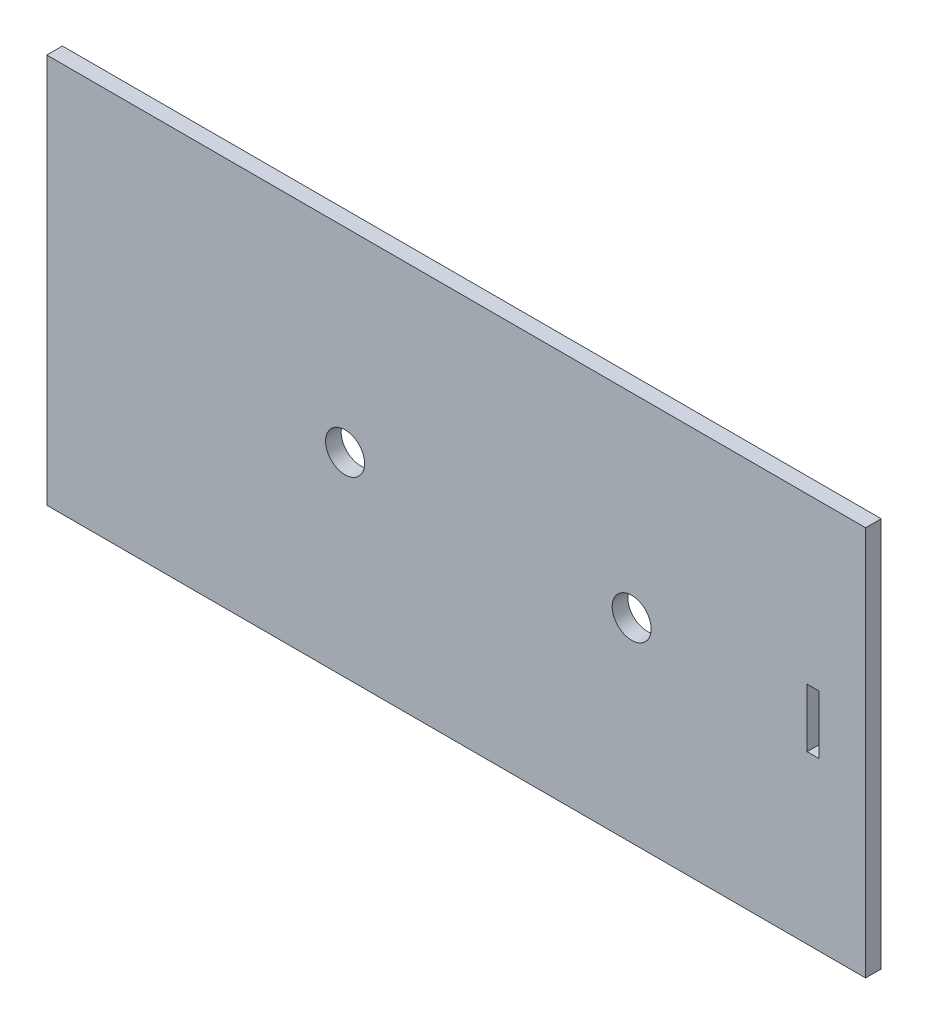
ISO-10303-21;
HEADER;
FILE_DESCRIPTION(('STEP AP214'),'2;1');
FILE_NAME('part.step','',(''),(''),'','','');
FILE_SCHEMA(('AUTOMOTIVE_DESIGN { 1 0 10303 214 1 1 1 1 }'));
ENDSEC;
DATA;
#1=APPLICATION_CONTEXT('core data for automotive mechanical design processes');
#2=APPLICATION_PROTOCOL_DEFINITION('international standard','automotive_design',2000,#1);
#3=PRODUCT_CONTEXT('',#1,'mechanical');
#4=PRODUCT('Part','Part','',(#3));
#5=PRODUCT_RELATED_PRODUCT_CATEGORY('part','',(#4));
#6=PRODUCT_DEFINITION_FORMATION('','',#4);
#7=PRODUCT_DEFINITION_CONTEXT('part definition',#1,'design');
#8=PRODUCT_DEFINITION('design','',#6,#7);
#9=PRODUCT_DEFINITION_SHAPE('','',#8);
#10=(LENGTH_UNIT() NAMED_UNIT(*) SI_UNIT(.MILLI.,.METRE.));
#11=(NAMED_UNIT(*) PLANE_ANGLE_UNIT() SI_UNIT($,.RADIAN.));
#12=(NAMED_UNIT(*) SI_UNIT($,.STERADIAN.) SOLID_ANGLE_UNIT());
#13=UNCERTAINTY_MEASURE_WITH_UNIT(LENGTH_MEASURE(1.E-05),#10,'distance_accuracy_value','');
#14=(GEOMETRIC_REPRESENTATION_CONTEXT(3) GLOBAL_UNCERTAINTY_ASSIGNED_CONTEXT((#13)) GLOBAL_UNIT_ASSIGNED_CONTEXT((#10,
#11,#12)) REPRESENTATION_CONTEXT('',''));
#15=CARTESIAN_POINT('',(0.,0.,0.));
#16=DIRECTION('',(0.,0.,1.));
#17=DIRECTION('',(1.,0.,0.));
#18=AXIS2_PLACEMENT_3D('',#15,#16,#17);
#19=CARTESIAN_POINT('',(0.,0.,4.));
#20=DIRECTION('',(0.,0.,-1.));
#21=DIRECTION('',(-1.,0.,0.));
#22=AXIS2_PLACEMENT_3D('',#19,#20,#21);
#23=PLANE('',#22);
#24=CARTESIAN_POINT('',(0.,0.,4.));
#25=DIRECTION('',(0.,0.,1.));
#26=DIRECTION('',(1.,0.,0.));
#27=AXIS2_PLACEMENT_3D('',#24,#25,#26);
#28=CIRCLE('',#27,5.);
#29=CARTESIAN_POINT('',(5.,0.,4.));
#30=VERTEX_POINT('',#29);
#31=EDGE_CURVE('E136',#30,#30,#28,.T.);
#32=ORIENTED_EDGE('',*,*,#31,.F.);
#33=EDGE_LOOP('',(#32));
#34=FACE_BOUND('',#33,.T.);
#35=DIRECTION('',(0.,1.,0.));
#36=VECTOR('',#35,1.);
#37=CARTESIAN_POINT('',(60.,-50.,4.));
#38=LINE('',#37,#36);
#39=CARTESIAN_POINT('',(60.,-50.,4.));
#40=VERTEX_POINT('',#39);
#41=CARTESIAN_POINT('',(60.,50.,4.));
#42=VERTEX_POINT('',#41);
#43=EDGE_CURVE('E142',#40,#42,#38,.T.);
#44=ORIENTED_EDGE('',*,*,#43,.T.);
#45=DIRECTION('',(-1.,0.,0.));
#46=VECTOR('',#45,1.);
#47=CARTESIAN_POINT('',(-150.,50.,4.));
#48=LINE('',#47,#46);
#49=CARTESIAN_POINT('',(-150.,50.,4.));
#50=VERTEX_POINT('',#49);
#51=EDGE_CURVE('E145',#42,#50,#48,.T.);
#52=ORIENTED_EDGE('',*,*,#51,.T.);
#53=DIRECTION('',(0.,-1.,0.));
#54=VECTOR('',#53,1.);
#55=CARTESIAN_POINT('',(-150.,-50.,4.));
#56=LINE('',#55,#54);
#57=CARTESIAN_POINT('',(-150.,-50.,4.));
#58=VERTEX_POINT('',#57);
#59=EDGE_CURVE('E148',#50,#58,#56,.T.);
#60=ORIENTED_EDGE('',*,*,#59,.T.);
#61=DIRECTION('',(1.,0.,0.));
#62=VECTOR('',#61,1.);
#63=CARTESIAN_POINT('',(-150.,-50.,4.));
#64=LINE('',#63,#62);
#65=EDGE_CURVE('E150',#58,#40,#64,.T.);
#66=ORIENTED_EDGE('',*,*,#65,.T.);
#67=EDGE_LOOP('',(#44,#52,#60,#66));
#68=FACE_BOUND('',#67,.T.);
#69=DIRECTION('',(0.,1.,0.));
#70=VECTOR('',#69,1.);
#71=CARTESIAN_POINT('',(48.,7.76206531965649,4.));
#72=LINE('',#71,#70);
#73=CARTESIAN_POINT('',(48.,-7.23793468034351,4.));
#74=VERTEX_POINT('',#73);
#75=CARTESIAN_POINT('',(48.,7.76206531965649,4.));
#76=VERTEX_POINT('',#75);
#77=EDGE_CURVE('E97',#74,#76,#72,.T.);
#78=ORIENTED_EDGE('',*,*,#77,.F.);
#79=DIRECTION('',(1.,0.,0.));
#80=VECTOR('',#79,1.);
#81=CARTESIAN_POINT('',(45.,-7.23793468034351,4.));
#82=LINE('',#81,#80);
#83=CARTESIAN_POINT('',(45.,-7.23793468034351,4.));
#84=VERTEX_POINT('',#83);
#85=EDGE_CURVE('E120',#84,#74,#82,.T.);
#86=ORIENTED_EDGE('',*,*,#85,.F.);
#87=DIRECTION('',(0.,-1.,0.));
#88=VECTOR('',#87,1.);
#89=CARTESIAN_POINT('',(45.,7.76206531965649,4.));
#90=LINE('',#89,#88);
#91=CARTESIAN_POINT('',(45.,7.76206531965649,4.));
#92=VERTEX_POINT('',#91);
#93=EDGE_CURVE('E118',#92,#84,#90,.T.);
#94=ORIENTED_EDGE('',*,*,#93,.F.);
#95=DIRECTION('',(-1.,0.,0.));
#96=VECTOR('',#95,1.);
#97=CARTESIAN_POINT('',(45.,7.76206531965649,4.));
#98=LINE('',#97,#96);
#99=EDGE_CURVE('E105',#76,#92,#98,.T.);
#100=ORIENTED_EDGE('',*,*,#99,.F.);
#101=EDGE_LOOP('',(#78,#86,#94,#100));
#102=FACE_BOUND('',#101,.T.);
#103=CARTESIAN_POINT('',(-73.5,0.,4.));
#104=DIRECTION('',(0.,0.,1.));
#105=DIRECTION('',(1.,0.,0.));
#106=AXIS2_PLACEMENT_3D('',#103,#104,#105);
#107=CIRCLE('',#106,5.);
#108=CARTESIAN_POINT('',(-68.5,0.,4.));
#109=VERTEX_POINT('',#108);
#110=EDGE_CURVE('E126',#109,#109,#107,.T.);
#111=ORIENTED_EDGE('',*,*,#110,.F.);
#112=EDGE_LOOP('',(#111));
#113=FACE_BOUND('',#112,.T.);
#114=ADVANCED_FACE('F32',(#34,#68,#102,#113),#23,.F.);
#115=CARTESIAN_POINT('',(0.,0.,0.));
#116=DIRECTION('',(0.,0.,-1.));
#117=DIRECTION('',(-1.,0.,0.));
#118=AXIS2_PLACEMENT_3D('',#115,#116,#117);
#119=PLANE('',#118);
#120=DIRECTION('',(1.,0.,0.));
#121=VECTOR('',#120,1.);
#122=CARTESIAN_POINT('',(45.,-7.23793468034351,0.));
#123=LINE('',#122,#121);
#124=CARTESIAN_POINT('',(45.,-7.23793468034351,0.));
#125=VERTEX_POINT('',#124);
#126=CARTESIAN_POINT('',(48.,-7.23793468034351,0.));
#127=VERTEX_POINT('',#126);
#128=EDGE_CURVE('E106',#125,#127,#123,.T.);
#129=ORIENTED_EDGE('',*,*,#128,.T.);
#130=DIRECTION('',(0.,1.,0.));
#131=VECTOR('',#130,1.);
#132=CARTESIAN_POINT('',(48.,7.76206531965649,0.));
#133=LINE('',#132,#131);
#134=CARTESIAN_POINT('',(48.,7.76206531965649,0.));
#135=VERTEX_POINT('',#134);
#136=EDGE_CURVE('E55',#127,#135,#133,.T.);
#137=ORIENTED_EDGE('',*,*,#136,.T.);
#138=DIRECTION('',(-1.,0.,0.));
#139=VECTOR('',#138,1.);
#140=CARTESIAN_POINT('',(45.,7.76206531965649,0.));
#141=LINE('',#140,#139);
#142=CARTESIAN_POINT('',(45.,7.76206531965649,0.));
#143=VERTEX_POINT('',#142);
#144=EDGE_CURVE('E112',#135,#143,#141,.T.);
#145=ORIENTED_EDGE('',*,*,#144,.T.);
#146=DIRECTION('',(0.,-1.,0.));
#147=VECTOR('',#146,1.);
#148=CARTESIAN_POINT('',(45.,7.76206531965649,0.));
#149=LINE('',#148,#147);
#150=EDGE_CURVE('E128',#143,#125,#149,.T.);
#151=ORIENTED_EDGE('',*,*,#150,.T.);
#152=EDGE_LOOP('',(#129,#137,#145,#151));
#153=FACE_BOUND('',#152,.T.);
#154=CARTESIAN_POINT('',(0.,0.,0.));
#155=DIRECTION('',(0.,0.,1.));
#156=DIRECTION('',(1.,0.,0.));
#157=AXIS2_PLACEMENT_3D('',#154,#155,#156);
#158=CIRCLE('',#157,5.);
#159=CARTESIAN_POINT('',(5.,0.,0.));
#160=VERTEX_POINT('',#159);
#161=EDGE_CURVE('E113',#160,#160,#158,.T.);
#162=ORIENTED_EDGE('',*,*,#161,.T.);
#163=EDGE_LOOP('',(#162));
#164=FACE_BOUND('',#163,.T.);
#165=DIRECTION('',(0.,1.,0.));
#166=VECTOR('',#165,1.);
#167=CARTESIAN_POINT('',(60.,-50.,0.));
#168=LINE('',#167,#166);
#169=CARTESIAN_POINT('',(60.,-50.,0.));
#170=VERTEX_POINT('',#169);
#171=CARTESIAN_POINT('',(60.,50.,0.));
#172=VERTEX_POINT('',#171);
#173=EDGE_CURVE('E139',#170,#172,#168,.T.);
#174=ORIENTED_EDGE('',*,*,#173,.F.);
#175=DIRECTION('',(1.,0.,0.));
#176=VECTOR('',#175,1.);
#177=CARTESIAN_POINT('',(-150.,-50.,0.));
#178=LINE('',#177,#176);
#179=CARTESIAN_POINT('',(-150.,-50.,0.));
#180=VERTEX_POINT('',#179);
#181=EDGE_CURVE('E146',#180,#170,#178,.T.);
#182=ORIENTED_EDGE('',*,*,#181,.F.);
#183=DIRECTION('',(0.,-1.,0.));
#184=VECTOR('',#183,1.);
#185=CARTESIAN_POINT('',(-150.,-50.,0.));
#186=LINE('',#185,#184);
#187=CARTESIAN_POINT('',(-150.,50.,0.));
#188=VERTEX_POINT('',#187);
#189=EDGE_CURVE('E157',#188,#180,#186,.T.);
#190=ORIENTED_EDGE('',*,*,#189,.F.);
#191=DIRECTION('',(-1.,0.,0.));
#192=VECTOR('',#191,1.);
#193=CARTESIAN_POINT('',(-150.,50.,0.));
#194=LINE('',#193,#192);
#195=EDGE_CURVE('E155',#172,#188,#194,.T.);
#196=ORIENTED_EDGE('',*,*,#195,.F.);
#197=EDGE_LOOP('',(#174,#182,#190,#196));
#198=FACE_BOUND('',#197,.T.);
#199=CARTESIAN_POINT('',(-73.5,0.,0.));
#200=DIRECTION('',(0.,0.,1.));
#201=DIRECTION('',(1.,0.,0.));
#202=AXIS2_PLACEMENT_3D('',#199,#200,#201);
#203=CIRCLE('',#202,5.);
#204=CARTESIAN_POINT('',(-68.5,0.,0.));
#205=VERTEX_POINT('',#204);
#206=EDGE_CURVE('E238',#205,#205,#203,.T.);
#207=ORIENTED_EDGE('',*,*,#206,.T.);
#208=EDGE_LOOP('',(#207));
#209=FACE_BOUND('',#208,.T.);
#210=ADVANCED_FACE('F175',(#153,#164,#198,#209),#119,.T.);
#211=CARTESIAN_POINT('',(60.,-50.,4.));
#212=DIRECTION('',(-1.,0.,0.));
#213=DIRECTION('',(0.,0.,1.));
#214=AXIS2_PLACEMENT_3D('',#211,#212,#213);
#215=PLANE('',#214);
#216=ORIENTED_EDGE('',*,*,#173,.T.);
#217=DIRECTION('',(0.,0.,-1.));
#218=VECTOR('',#217,1.);
#219=CARTESIAN_POINT('',(60.,50.,4.));
#220=LINE('',#219,#218);
#221=EDGE_CURVE('E11',#42,#172,#220,.T.);
#222=ORIENTED_EDGE('',*,*,#221,.F.);
#223=ORIENTED_EDGE('',*,*,#43,.F.);
#224=DIRECTION('',(0.,0.,-1.));
#225=VECTOR('',#224,1.);
#226=CARTESIAN_POINT('',(60.,-50.,4.));
#227=LINE('',#226,#225);
#228=EDGE_CURVE('E152',#40,#170,#227,.T.);
#229=ORIENTED_EDGE('',*,*,#228,.T.);
#230=EDGE_LOOP('',(#216,#222,#223,#229));
#231=FACE_BOUND('',#230,.T.);
#232=ADVANCED_FACE('F34',(#231),#215,.F.);
#233=CARTESIAN_POINT('',(-150.,50.,4.));
#234=DIRECTION('',(0.,-1.,0.));
#235=DIRECTION('',(0.,0.,-1.));
#236=AXIS2_PLACEMENT_3D('',#233,#234,#235);
#237=PLANE('',#236);
#238=ORIENTED_EDGE('',*,*,#195,.T.);
#239=DIRECTION('',(0.,0.,-1.));
#240=VECTOR('',#239,1.);
#241=CARTESIAN_POINT('',(-150.,50.,4.));
#242=LINE('',#241,#240);
#243=EDGE_CURVE('E40',#50,#188,#242,.T.);
#244=ORIENTED_EDGE('',*,*,#243,.F.);
#245=ORIENTED_EDGE('',*,*,#51,.F.);
#246=ORIENTED_EDGE('',*,*,#221,.T.);
#247=EDGE_LOOP('',(#238,#244,#245,#246));
#248=FACE_BOUND('',#247,.T.);
#249=ADVANCED_FACE('F185',(#248),#237,.F.);
#250=CARTESIAN_POINT('',(-150.,-50.,4.));
#251=DIRECTION('',(1.,0.,0.));
#252=DIRECTION('',(0.,0.,-1.));
#253=AXIS2_PLACEMENT_3D('',#250,#251,#252);
#254=PLANE('',#253);
#255=ORIENTED_EDGE('',*,*,#189,.T.);
#256=DIRECTION('',(0.,0.,-1.));
#257=VECTOR('',#256,1.);
#258=CARTESIAN_POINT('',(-150.,-50.,4.));
#259=LINE('',#258,#257);
#260=EDGE_CURVE('E162',#58,#180,#259,.T.);
#261=ORIENTED_EDGE('',*,*,#260,.F.);
#262=ORIENTED_EDGE('',*,*,#59,.F.);
#263=ORIENTED_EDGE('',*,*,#243,.T.);
#264=EDGE_LOOP('',(#255,#261,#262,#263));
#265=FACE_BOUND('',#264,.T.);
#266=ADVANCED_FACE('F169',(#265),#254,.F.);
#267=CARTESIAN_POINT('',(-150.,-50.,4.));
#268=DIRECTION('',(0.,1.,0.));
#269=DIRECTION('',(0.,0.,1.));
#270=AXIS2_PLACEMENT_3D('',#267,#268,#269);
#271=PLANE('',#270);
#272=ORIENTED_EDGE('',*,*,#181,.T.);
#273=ORIENTED_EDGE('',*,*,#228,.F.);
#274=ORIENTED_EDGE('',*,*,#65,.F.);
#275=ORIENTED_EDGE('',*,*,#260,.T.);
#276=EDGE_LOOP('',(#272,#273,#274,#275));
#277=FACE_BOUND('',#276,.T.);
#278=ADVANCED_FACE('F179',(#277),#271,.F.);
#279=CARTESIAN_POINT('',(0.,0.,4.));
#280=DIRECTION('',(0.,0.,-1.));
#281=DIRECTION('',(-1.,0.,0.));
#282=AXIS2_PLACEMENT_3D('',#279,#280,#281);
#283=CYLINDRICAL_SURFACE('',#282,5.);
#284=ORIENTED_EDGE('',*,*,#31,.T.);
#285=EDGE_LOOP('',(#284));
#286=FACE_BOUND('',#285,.T.);
#287=ORIENTED_EDGE('',*,*,#161,.F.);
#288=EDGE_LOOP('',(#287));
#289=FACE_BOUND('',#288,.T.);
#290=ADVANCED_FACE('F202',(#286,#289),#283,.F.);
#291=CARTESIAN_POINT('',(48.,7.76206531965649,4.));
#292=DIRECTION('',(-1.,0.,0.));
#293=DIRECTION('',(0.,-1.,0.));
#294=AXIS2_PLACEMENT_3D('',#291,#292,#293);
#295=PLANE('',#294);
#296=ORIENTED_EDGE('',*,*,#136,.F.);
#297=DIRECTION('',(0.,0.,-1.));
#298=VECTOR('',#297,1.);
#299=CARTESIAN_POINT('',(48.,-7.23793468034351,4.));
#300=LINE('',#299,#298);
#301=EDGE_CURVE('E101',#74,#127,#300,.T.);
#302=ORIENTED_EDGE('',*,*,#301,.F.);
#303=ORIENTED_EDGE('',*,*,#77,.T.);
#304=DIRECTION('',(0.,0.,-1.));
#305=VECTOR('',#304,1.);
#306=CARTESIAN_POINT('',(48.,7.76206531965649,4.));
#307=LINE('',#306,#305);
#308=EDGE_CURVE('E100',#76,#135,#307,.T.);
#309=ORIENTED_EDGE('',*,*,#308,.T.);
#310=EDGE_LOOP('',(#296,#302,#303,#309));
#311=FACE_BOUND('',#310,.T.);
#312=ADVANCED_FACE('F99',(#311),#295,.T.);
#313=CARTESIAN_POINT('',(45.,7.76206531965649,4.));
#314=DIRECTION('',(0.,-1.,0.));
#315=DIRECTION('',(0.,0.,-1.));
#316=AXIS2_PLACEMENT_3D('',#313,#314,#315);
#317=PLANE('',#316);
#318=ORIENTED_EDGE('',*,*,#144,.F.);
#319=ORIENTED_EDGE('',*,*,#308,.F.);
#320=ORIENTED_EDGE('',*,*,#99,.T.);
#321=DIRECTION('',(0.,0.,-1.));
#322=VECTOR('',#321,1.);
#323=CARTESIAN_POINT('',(45.,7.76206531965649,4.));
#324=LINE('',#323,#322);
#325=EDGE_CURVE('E114',#92,#143,#324,.T.);
#326=ORIENTED_EDGE('',*,*,#325,.T.);
#327=EDGE_LOOP('',(#318,#319,#320,#326));
#328=FACE_BOUND('',#327,.T.);
#329=ADVANCED_FACE('F109',(#328),#317,.T.);
#330=CARTESIAN_POINT('',(45.,7.76206531965649,4.));
#331=DIRECTION('',(1.,0.,0.));
#332=DIRECTION('',(0.,0.,-1.));
#333=AXIS2_PLACEMENT_3D('',#330,#331,#332);
#334=PLANE('',#333);
#335=ORIENTED_EDGE('',*,*,#150,.F.);
#336=ORIENTED_EDGE('',*,*,#325,.F.);
#337=ORIENTED_EDGE('',*,*,#93,.T.);
#338=DIRECTION('',(0.,0.,-1.));
#339=VECTOR('',#338,1.);
#340=CARTESIAN_POINT('',(45.,-7.23793468034351,4.));
#341=LINE('',#340,#339);
#342=EDGE_CURVE('E47',#84,#125,#341,.T.);
#343=ORIENTED_EDGE('',*,*,#342,.T.);
#344=EDGE_LOOP('',(#335,#336,#337,#343));
#345=FACE_BOUND('',#344,.T.);
#346=ADVANCED_FACE('F219',(#345),#334,.T.);
#347=CARTESIAN_POINT('',(45.,-7.23793468034351,4.));
#348=DIRECTION('',(0.,1.,0.));
#349=DIRECTION('',(0.,0.,1.));
#350=AXIS2_PLACEMENT_3D('',#347,#348,#349);
#351=PLANE('',#350);
#352=ORIENTED_EDGE('',*,*,#128,.F.);
#353=ORIENTED_EDGE('',*,*,#342,.F.);
#354=ORIENTED_EDGE('',*,*,#85,.T.);
#355=ORIENTED_EDGE('',*,*,#301,.T.);
#356=EDGE_LOOP('',(#352,#353,#354,#355));
#357=FACE_BOUND('',#356,.T.);
#358=ADVANCED_FACE('F224',(#357),#351,.T.);
#359=CARTESIAN_POINT('',(-73.5,0.,4.));
#360=DIRECTION('',(0.,0.,-1.));
#361=DIRECTION('',(-1.,0.,0.));
#362=AXIS2_PLACEMENT_3D('',#359,#360,#361);
#363=CYLINDRICAL_SURFACE('',#362,5.);
#364=ORIENTED_EDGE('',*,*,#110,.T.);
#365=EDGE_LOOP('',(#364));
#366=FACE_BOUND('',#365,.T.);
#367=ORIENTED_EDGE('',*,*,#206,.F.);
#368=EDGE_LOOP('',(#367));
#369=FACE_BOUND('',#368,.T.);
#370=ADVANCED_FACE('F228',(#366,#369),#363,.F.);
#371=CLOSED_SHELL('',(#114,#210,#232,#249,#266,#278,#290,#312,#329,#346,#358,#370));
#372=MANIFOLD_SOLID_BREP('B2',#371);
#373=ADVANCED_BREP_SHAPE_REPRESENTATION('',(#18,#372),#14);
#374=SHAPE_DEFINITION_REPRESENTATION(#9,#373);
ENDSEC;
END-ISO-10303-21;
